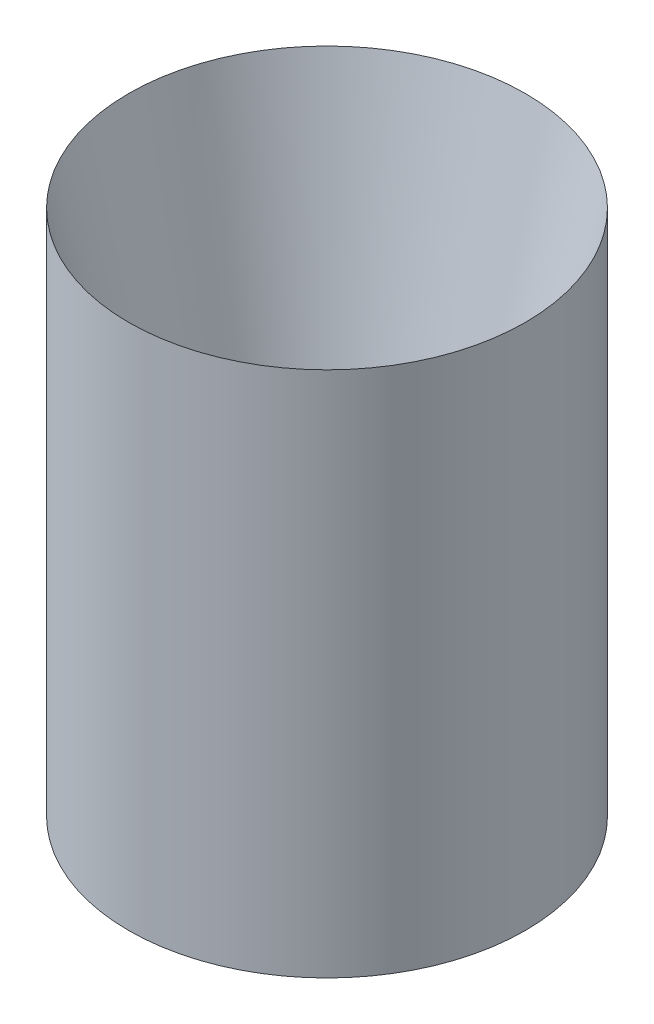
ISO-10303-21;
HEADER;
FILE_DESCRIPTION(('STEP AP214'),'2;1');
FILE_NAME('part.step','',(''),(''),'','','');
FILE_SCHEMA(('AUTOMOTIVE_DESIGN { 1 0 10303 214 1 1 1 1 }'));
ENDSEC;
DATA;
#1=APPLICATION_CONTEXT('core data for automotive mechanical design processes');
#2=APPLICATION_PROTOCOL_DEFINITION('international standard','automotive_design',2000,#1);
#3=PRODUCT_CONTEXT('',#1,'mechanical');
#4=PRODUCT('Part','Part','',(#3));
#5=PRODUCT_RELATED_PRODUCT_CATEGORY('part','',(#4));
#6=PRODUCT_DEFINITION_FORMATION('','',#4);
#7=PRODUCT_DEFINITION_CONTEXT('part definition',#1,'design');
#8=PRODUCT_DEFINITION('design','',#6,#7);
#9=PRODUCT_DEFINITION_SHAPE('','',#8);
#10=(LENGTH_UNIT() NAMED_UNIT(*) SI_UNIT(.MILLI.,.METRE.));
#11=(NAMED_UNIT(*) PLANE_ANGLE_UNIT() SI_UNIT($,.RADIAN.));
#12=(NAMED_UNIT(*) SI_UNIT($,.STERADIAN.) SOLID_ANGLE_UNIT());
#13=UNCERTAINTY_MEASURE_WITH_UNIT(LENGTH_MEASURE(1.E-05),#10,'distance_accuracy_value','');
#14=(GEOMETRIC_REPRESENTATION_CONTEXT(3) GLOBAL_UNCERTAINTY_ASSIGNED_CONTEXT((#13)) GLOBAL_UNIT_ASSIGNED_CONTEXT((#10,
#11,#12)) REPRESENTATION_CONTEXT('',''));
#15=CARTESIAN_POINT('',(0.,0.,0.));
#16=DIRECTION('',(0.,0.,1.));
#17=DIRECTION('',(1.,0.,0.));
#18=AXIS2_PLACEMENT_3D('',#15,#16,#17);
#19=CARTESIAN_POINT('',(0.,0.,0.));
#20=DIRECTION('',(0.,1.,0.));
#21=DIRECTION('',(0.,0.,1.));
#22=AXIS2_PLACEMENT_3D('',#19,#20,#21);
#23=CONICAL_SURFACE('',#22,22.225,0.217634333752505);
#24=CARTESIAN_POINT('',(0.,143.002,0.));
#25=DIRECTION('',(0.,-1.,0.));
#26=DIRECTION('',(0.,0.,-1.));
#27=AXIS2_PLACEMENT_3D('',#24,#25,#26);
#28=CIRCLE('',#27,53.848);
#29=CARTESIAN_POINT('',(0.,143.002,-53.848));
#30=VERTEX_POINT('',#29);
#31=EDGE_CURVE('E55',#30,#30,#28,.T.);
#32=ORIENTED_EDGE('',*,*,#31,.F.);
#33=EDGE_LOOP('',(#32));
#34=FACE_BOUND('',#33,.T.);
#35=CARTESIAN_POINT('',(0.,0.,0.));
#36=DIRECTION('',(0.,-1.,0.));
#37=DIRECTION('',(0.,0.,-1.));
#38=AXIS2_PLACEMENT_3D('',#35,#36,#37);
#39=CIRCLE('',#38,22.225);
#40=CARTESIAN_POINT('',(0.,0.,-22.225));
#41=VERTEX_POINT('',#40);
#42=EDGE_CURVE('E10',#41,#41,#39,.T.);
#43=ORIENTED_EDGE('',*,*,#42,.T.);
#44=EDGE_LOOP('',(#43));
#45=FACE_BOUND('',#44,.T.);
#46=ADVANCED_FACE('F43',(#34,#45),#23,.F.);
#47=CARTESIAN_POINT('',(-22.225,0.,0.));
#48=DIRECTION('',(0.,1.,0.));
#49=DIRECTION('',(0.,0.,1.));
#50=AXIS2_PLACEMENT_3D('',#47,#48,#49);
#51=PLANE('',#50);
#52=ORIENTED_EDGE('',*,*,#42,.F.);
#53=EDGE_LOOP('',(#52));
#54=FACE_BOUND('',#53,.T.);
#55=CARTESIAN_POINT('',(0.,0.,0.));
#56=DIRECTION('',(0.,-1.,0.));
#57=DIRECTION('',(0.,0.,-1.));
#58=AXIS2_PLACEMENT_3D('',#55,#56,#57);
#59=CIRCLE('',#58,53.848);
#60=CARTESIAN_POINT('',(0.,0.,-53.848));
#61=VERTEX_POINT('',#60);
#62=EDGE_CURVE('E50',#61,#61,#59,.T.);
#63=ORIENTED_EDGE('',*,*,#62,.T.);
#64=EDGE_LOOP('',(#63));
#65=FACE_BOUND('',#64,.T.);
#66=ADVANCED_FACE('F66',(#54,#65),#51,.F.);
#67=CARTESIAN_POINT('',(0.,0.,0.));
#68=DIRECTION('',(0.,-1.,0.));
#69=DIRECTION('',(0.,0.,-1.));
#70=AXIS2_PLACEMENT_3D('',#67,#68,#69);
#71=CYLINDRICAL_SURFACE('',#70,53.848);
#72=ORIENTED_EDGE('',*,*,#62,.F.);
#73=EDGE_LOOP('',(#72));
#74=FACE_BOUND('',#73,.T.);
#75=ORIENTED_EDGE('',*,*,#31,.T.);
#76=EDGE_LOOP('',(#75));
#77=FACE_BOUND('',#76,.T.);
#78=ADVANCED_FACE('F63',(#74,#77),#71,.T.);
#79=CLOSED_SHELL('',(#46,#66,#78));
#80=MANIFOLD_SOLID_BREP('B2',#79);
#81=ADVANCED_BREP_SHAPE_REPRESENTATION('',(#18,#80),#14);
#82=SHAPE_DEFINITION_REPRESENTATION(#9,#81);
ENDSEC;
END-ISO-10303-21;
